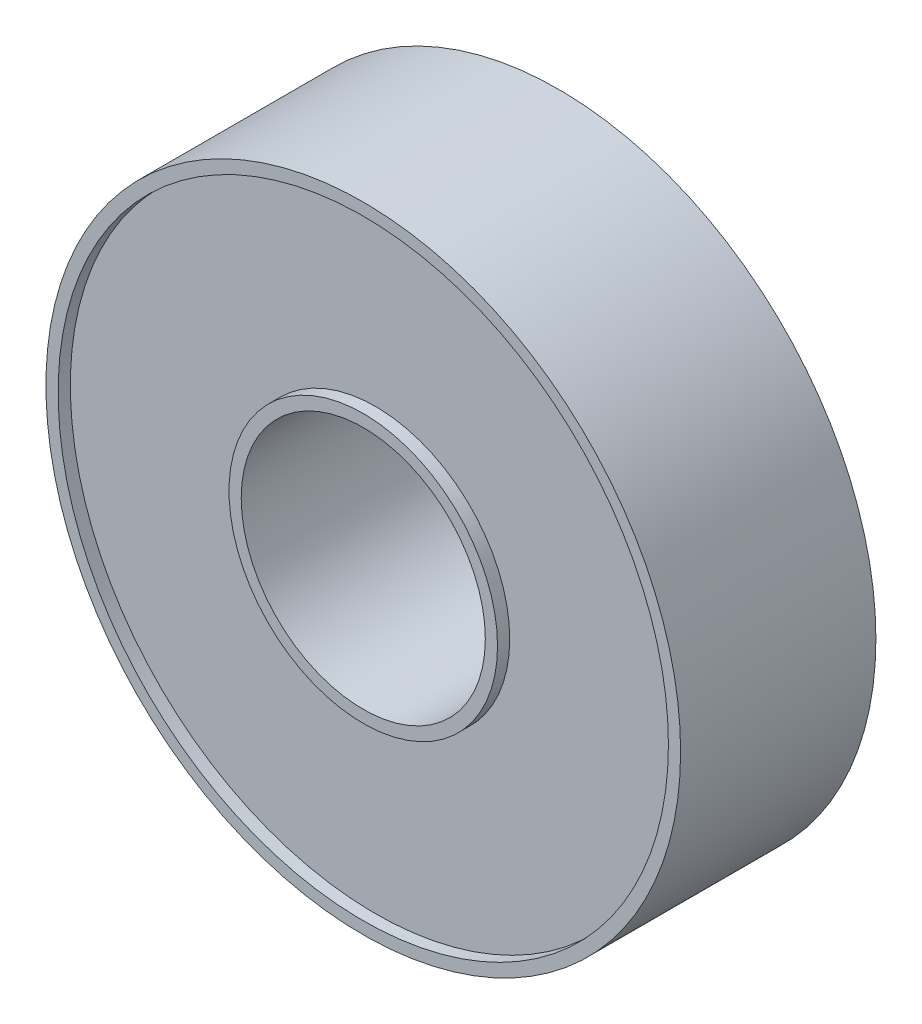
ISO-10303-21;
HEADER;
FILE_DESCRIPTION(('STEP AP214'),'2;1');
FILE_NAME('part.step','',(''),(''),'','','');
FILE_SCHEMA(('AUTOMOTIVE_DESIGN { 1 0 10303 214 1 1 1 1 }'));
ENDSEC;
DATA;
#1=APPLICATION_CONTEXT('core data for automotive mechanical design processes');
#2=APPLICATION_PROTOCOL_DEFINITION('international standard','automotive_design',2000,#1);
#3=PRODUCT_CONTEXT('',#1,'mechanical');
#4=PRODUCT('Part','Part','',(#3));
#5=PRODUCT_RELATED_PRODUCT_CATEGORY('part','',(#4));
#6=PRODUCT_DEFINITION_FORMATION('','',#4);
#7=PRODUCT_DEFINITION_CONTEXT('part definition',#1,'design');
#8=PRODUCT_DEFINITION('design','',#6,#7);
#9=PRODUCT_DEFINITION_SHAPE('','',#8);
#10=(LENGTH_UNIT() NAMED_UNIT(*) SI_UNIT(.MILLI.,.METRE.));
#11=(NAMED_UNIT(*) PLANE_ANGLE_UNIT() SI_UNIT($,.RADIAN.));
#12=(NAMED_UNIT(*) SI_UNIT($,.STERADIAN.) SOLID_ANGLE_UNIT());
#13=UNCERTAINTY_MEASURE_WITH_UNIT(LENGTH_MEASURE(1.E-05),#10,'distance_accuracy_value','');
#14=(GEOMETRIC_REPRESENTATION_CONTEXT(3) GLOBAL_UNCERTAINTY_ASSIGNED_CONTEXT((#13)) GLOBAL_UNIT_ASSIGNED_CONTEXT((#10,
#11,#12)) REPRESENTATION_CONTEXT('',''));
#15=CARTESIAN_POINT('',(0.,0.,0.));
#16=DIRECTION('',(0.,0.,1.));
#17=DIRECTION('',(1.,0.,0.));
#18=AXIS2_PLACEMENT_3D('',#15,#16,#17);
#19=CARTESIAN_POINT('',(0.,0.,0.));
#20=DIRECTION('',(0.,0.,1.));
#21=DIRECTION('',(1.,0.,0.));
#22=AXIS2_PLACEMENT_3D('',#19,#20,#21);
#23=PLANE('',#22);
#24=CARTESIAN_POINT('',(0.,0.,0.));
#25=DIRECTION('',(0.,0.,1.));
#26=DIRECTION('',(1.,0.,0.));
#27=AXIS2_PLACEMENT_3D('',#24,#25,#26);
#28=CIRCLE('',#27,5.);
#29=CARTESIAN_POINT('',(5.,0.,0.));
#30=VERTEX_POINT('',#29);
#31=EDGE_CURVE('E53',#30,#30,#28,.T.);
#32=ORIENTED_EDGE('',*,*,#31,.T.);
#33=EDGE_LOOP('',(#32));
#34=FACE_BOUND('',#33,.T.);
#35=CARTESIAN_POINT('',(0.,0.,0.));
#36=DIRECTION('',(0.,0.,1.));
#37=DIRECTION('',(1.,0.,0.));
#38=AXIS2_PLACEMENT_3D('',#35,#36,#37);
#39=CIRCLE('',#38,5.5);
#40=CARTESIAN_POINT('',(5.5,0.,0.));
#41=VERTEX_POINT('',#40);
#42=EDGE_CURVE('E84',#41,#41,#39,.T.);
#43=ORIENTED_EDGE('',*,*,#42,.F.);
#44=EDGE_LOOP('',(#43));
#45=FACE_BOUND('',#44,.T.);
#46=ADVANCED_FACE('F36',(#34,#45),#23,.F.);
#47=CARTESIAN_POINT('',(0.,0.,8.));
#48=DIRECTION('',(0.,0.,1.));
#49=DIRECTION('',(1.,0.,0.));
#50=AXIS2_PLACEMENT_3D('',#47,#48,#49);
#51=PLANE('',#50);
#52=CARTESIAN_POINT('',(0.,0.,8.));
#53=DIRECTION('',(0.,0.,1.));
#54=DIRECTION('',(1.,0.,0.));
#55=AXIS2_PLACEMENT_3D('',#52,#53,#54);
#56=CIRCLE('',#55,5.);
#57=CARTESIAN_POINT('',(5.,0.,8.));
#58=VERTEX_POINT('',#57);
#59=EDGE_CURVE('E51',#58,#58,#56,.T.);
#60=ORIENTED_EDGE('',*,*,#59,.F.);
#61=EDGE_LOOP('',(#60));
#62=FACE_BOUND('',#61,.T.);
#63=CARTESIAN_POINT('',(0.,0.,8.));
#64=DIRECTION('',(0.,0.,1.));
#65=DIRECTION('',(1.,0.,0.));
#66=AXIS2_PLACEMENT_3D('',#63,#64,#65);
#67=CIRCLE('',#66,5.5);
#68=CARTESIAN_POINT('',(5.5,0.,8.));
#69=VERTEX_POINT('',#68);
#70=EDGE_CURVE('E69',#69,#69,#67,.T.);
#71=ORIENTED_EDGE('',*,*,#70,.T.);
#72=EDGE_LOOP('',(#71));
#73=FACE_BOUND('',#72,.T.);
#74=ADVANCED_FACE('F101',(#62,#73),#51,.T.);
#75=CARTESIAN_POINT('',(0.,0.,8.));
#76=DIRECTION('',(0.,0.,1.));
#77=DIRECTION('',(1.,0.,0.));
#78=AXIS2_PLACEMENT_3D('',#75,#76,#77);
#79=CIRCLE('',#78,12.5);
#80=CARTESIAN_POINT('',(12.5,0.,8.));
#81=VERTEX_POINT('',#80);
#82=EDGE_CURVE('E61',#81,#81,#79,.T.);
#83=ORIENTED_EDGE('',*,*,#82,.F.);
#84=EDGE_LOOP('',(#83));
#85=FACE_BOUND('',#84,.T.);
#86=CARTESIAN_POINT('',(0.,0.,8.));
#87=DIRECTION('',(0.,0.,1.));
#88=DIRECTION('',(1.,0.,0.));
#89=AXIS2_PLACEMENT_3D('',#86,#87,#88);
#90=CIRCLE('',#89,13.);
#91=CARTESIAN_POINT('',(13.,0.,8.));
#92=VERTEX_POINT('',#91);
#93=EDGE_CURVE('E10',#92,#92,#90,.T.);
#94=ORIENTED_EDGE('',*,*,#93,.T.);
#95=EDGE_LOOP('',(#94));
#96=FACE_BOUND('',#95,.T.);
#97=ADVANCED_FACE('F107',(#85,#96),#51,.T.);
#98=CARTESIAN_POINT('',(0.,0.,0.));
#99=DIRECTION('',(0.,0.,1.));
#100=DIRECTION('',(1.,0.,0.));
#101=AXIS2_PLACEMENT_3D('',#98,#99,#100);
#102=CIRCLE('',#101,12.5);
#103=CARTESIAN_POINT('',(12.5,0.,0.));
#104=VERTEX_POINT('',#103);
#105=EDGE_CURVE('E77',#104,#104,#102,.T.);
#106=ORIENTED_EDGE('',*,*,#105,.T.);
#107=EDGE_LOOP('',(#106));
#108=FACE_BOUND('',#107,.T.);
#109=CARTESIAN_POINT('',(0.,0.,0.));
#110=DIRECTION('',(0.,0.,1.));
#111=DIRECTION('',(1.,0.,0.));
#112=AXIS2_PLACEMENT_3D('',#109,#110,#111);
#113=CIRCLE('',#112,13.);
#114=CARTESIAN_POINT('',(13.,0.,0.));
#115=VERTEX_POINT('',#114);
#116=EDGE_CURVE('E40',#115,#115,#113,.T.);
#117=ORIENTED_EDGE('',*,*,#116,.F.);
#118=EDGE_LOOP('',(#117));
#119=FACE_BOUND('',#118,.T.);
#120=ADVANCED_FACE('F103',(#108,#119),#23,.F.);
#121=CARTESIAN_POINT('',(0.,0.,8.));
#122=DIRECTION('',(0.,0.,-1.));
#123=DIRECTION('',(-1.,0.,0.));
#124=AXIS2_PLACEMENT_3D('',#121,#122,#123);
#125=CYLINDRICAL_SURFACE('',#124,13.);
#126=ORIENTED_EDGE('',*,*,#93,.F.);
#127=EDGE_LOOP('',(#126));
#128=FACE_BOUND('',#127,.T.);
#129=ORIENTED_EDGE('',*,*,#116,.T.);
#130=EDGE_LOOP('',(#129));
#131=FACE_BOUND('',#130,.T.);
#132=ADVANCED_FACE('F38',(#128,#131),#125,.T.);
#133=CARTESIAN_POINT('',(0.,0.,8.));
#134=DIRECTION('',(0.,0.,-1.));
#135=DIRECTION('',(-1.,0.,0.));
#136=AXIS2_PLACEMENT_3D('',#133,#134,#135);
#137=CYLINDRICAL_SURFACE('',#136,5.);
#138=ORIENTED_EDGE('',*,*,#59,.T.);
#139=EDGE_LOOP('',(#138));
#140=FACE_BOUND('',#139,.T.);
#141=ORIENTED_EDGE('',*,*,#31,.F.);
#142=EDGE_LOOP('',(#141));
#143=FACE_BOUND('',#142,.T.);
#144=ADVANCED_FACE('F116',(#140,#143),#137,.F.);
#145=CARTESIAN_POINT('',(0.,0.,7.5));
#146=DIRECTION('',(0.,0.,1.));
#147=DIRECTION('',(1.,0.,0.));
#148=AXIS2_PLACEMENT_3D('',#145,#146,#147);
#149=CYLINDRICAL_SURFACE('',#148,12.5);
#150=CARTESIAN_POINT('',(0.,0.,7.5));
#151=DIRECTION('',(0.,0.,1.));
#152=DIRECTION('',(1.,0.,0.));
#153=AXIS2_PLACEMENT_3D('',#150,#151,#152);
#154=CIRCLE('',#153,12.5);
#155=CARTESIAN_POINT('',(12.5,0.,7.5));
#156=VERTEX_POINT('',#155);
#157=EDGE_CURVE('E57',#156,#156,#154,.T.);
#158=ORIENTED_EDGE('',*,*,#157,.F.);
#159=EDGE_LOOP('',(#158));
#160=FACE_BOUND('',#159,.T.);
#161=ORIENTED_EDGE('',*,*,#82,.T.);
#162=EDGE_LOOP('',(#161));
#163=FACE_BOUND('',#162,.T.);
#164=ADVANCED_FACE('F140',(#160,#163),#149,.F.);
#165=CARTESIAN_POINT('',(0.,0.,7.5));
#166=DIRECTION('',(0.,0.,1.));
#167=DIRECTION('',(1.,0.,0.));
#168=AXIS2_PLACEMENT_3D('',#165,#166,#167);
#169=PLANE('',#168);
#170=CARTESIAN_POINT('',(0.,0.,7.5));
#171=DIRECTION('',(0.,0.,1.));
#172=DIRECTION('',(1.,0.,0.));
#173=AXIS2_PLACEMENT_3D('',#170,#171,#172);
#174=CIRCLE('',#173,5.5);
#175=CARTESIAN_POINT('',(5.5,0.,7.5));
#176=VERTEX_POINT('',#175);
#177=EDGE_CURVE('E65',#176,#176,#174,.T.);
#178=ORIENTED_EDGE('',*,*,#177,.F.);
#179=EDGE_LOOP('',(#178));
#180=FACE_BOUND('',#179,.T.);
#181=ORIENTED_EDGE('',*,*,#157,.T.);
#182=EDGE_LOOP('',(#181));
#183=FACE_BOUND('',#182,.T.);
#184=ADVANCED_FACE('F136',(#180,#183),#169,.T.);
#185=CARTESIAN_POINT('',(0.,0.,7.5));
#186=DIRECTION('',(0.,0.,1.));
#187=DIRECTION('',(1.,0.,0.));
#188=AXIS2_PLACEMENT_3D('',#185,#186,#187);
#189=CYLINDRICAL_SURFACE('',#188,5.5);
#190=ORIENTED_EDGE('',*,*,#177,.T.);
#191=EDGE_LOOP('',(#190));
#192=FACE_BOUND('',#191,.T.);
#193=ORIENTED_EDGE('',*,*,#70,.F.);
#194=EDGE_LOOP('',(#193));
#195=FACE_BOUND('',#194,.T.);
#196=ADVANCED_FACE('F130',(#192,#195),#189,.T.);
#197=CARTESIAN_POINT('',(0.,0.,0.5));
#198=DIRECTION('',(0.,0.,-1.));
#199=DIRECTION('',(1.,0.,0.));
#200=AXIS2_PLACEMENT_3D('',#197,#198,#199);
#201=PLANE('',#200);
#202=CARTESIAN_POINT('',(0.,0.,0.5));
#203=DIRECTION('',(0.,0.,1.));
#204=DIRECTION('',(1.,0.,0.));
#205=AXIS2_PLACEMENT_3D('',#202,#203,#204);
#206=CIRCLE('',#205,12.5);
#207=CARTESIAN_POINT('',(12.5,0.,0.5));
#208=VERTEX_POINT('',#207);
#209=EDGE_CURVE('E73',#208,#208,#206,.T.);
#210=ORIENTED_EDGE('',*,*,#209,.F.);
#211=EDGE_LOOP('',(#210));
#212=FACE_BOUND('',#211,.T.);
#213=CARTESIAN_POINT('',(0.,0.,0.5));
#214=DIRECTION('',(0.,0.,1.));
#215=DIRECTION('',(1.,0.,0.));
#216=AXIS2_PLACEMENT_3D('',#213,#214,#215);
#217=CIRCLE('',#216,5.5);
#218=CARTESIAN_POINT('',(5.5,0.,0.5));
#219=VERTEX_POINT('',#218);
#220=EDGE_CURVE('E81',#219,#219,#217,.T.);
#221=ORIENTED_EDGE('',*,*,#220,.T.);
#222=EDGE_LOOP('',(#221));
#223=FACE_BOUND('',#222,.T.);
#224=ADVANCED_FACE('F91',(#212,#223),#201,.T.);
#225=CARTESIAN_POINT('',(0.,0.,0.5));
#226=DIRECTION('',(0.,0.,-1.));
#227=DIRECTION('',(-1.,0.,0.));
#228=AXIS2_PLACEMENT_3D('',#225,#226,#227);
#229=CYLINDRICAL_SURFACE('',#228,12.5);
#230=ORIENTED_EDGE('',*,*,#209,.T.);
#231=EDGE_LOOP('',(#230));
#232=FACE_BOUND('',#231,.T.);
#233=ORIENTED_EDGE('',*,*,#105,.F.);
#234=EDGE_LOOP('',(#233));
#235=FACE_BOUND('',#234,.T.);
#236=ADVANCED_FACE('F96',(#232,#235),#229,.F.);
#237=CARTESIAN_POINT('',(0.,0.,0.5));
#238=DIRECTION('',(0.,0.,-1.));
#239=DIRECTION('',(-1.,0.,0.));
#240=AXIS2_PLACEMENT_3D('',#237,#238,#239);
#241=CYLINDRICAL_SURFACE('',#240,5.5);
#242=ORIENTED_EDGE('',*,*,#220,.F.);
#243=EDGE_LOOP('',(#242));
#244=FACE_BOUND('',#243,.T.);
#245=ORIENTED_EDGE('',*,*,#42,.T.);
#246=EDGE_LOOP('',(#245));
#247=FACE_BOUND('',#246,.T.);
#248=ADVANCED_FACE('F93',(#244,#247),#241,.T.);
#249=CLOSED_SHELL('',(#46,#74,#97,#120,#132,#144,#164,#184,#196,#224,#236,#248));
#250=MANIFOLD_SOLID_BREP('B2',#249);
#251=ADVANCED_BREP_SHAPE_REPRESENTATION('',(#18,#250),#14);
#252=SHAPE_DEFINITION_REPRESENTATION(#9,#251);
ENDSEC;
END-ISO-10303-21;
